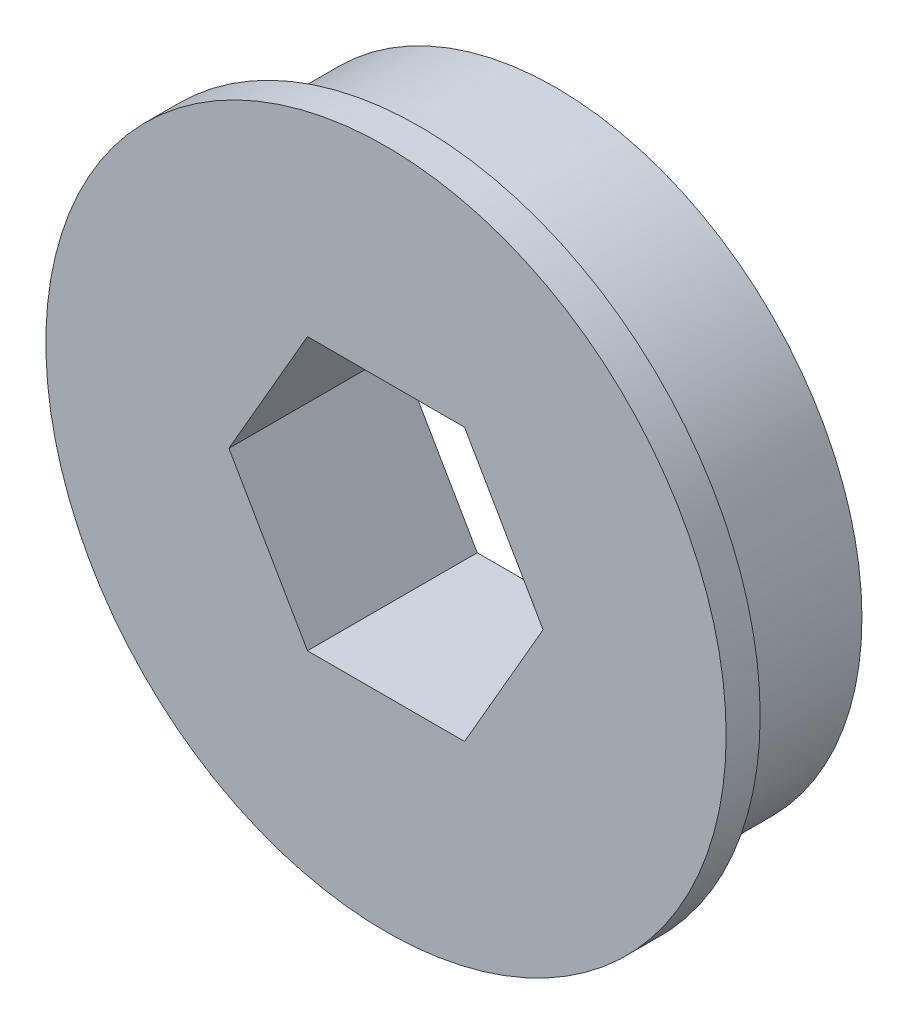
ISO-10303-21;
HEADER;
FILE_DESCRIPTION(('STEP AP214'),'2;1');
FILE_NAME('part.step','',(''),(''),'','','');
FILE_SCHEMA(('AUTOMOTIVE_DESIGN { 1 0 10303 214 1 1 1 1 }'));
ENDSEC;
DATA;
#1=APPLICATION_CONTEXT('core data for automotive mechanical design processes');
#2=APPLICATION_PROTOCOL_DEFINITION('international standard','automotive_design',2000,#1);
#3=PRODUCT_CONTEXT('',#1,'mechanical');
#4=PRODUCT('Part','Part','',(#3));
#5=PRODUCT_RELATED_PRODUCT_CATEGORY('part','',(#4));
#6=PRODUCT_DEFINITION_FORMATION('','',#4);
#7=PRODUCT_DEFINITION_CONTEXT('part definition',#1,'design');
#8=PRODUCT_DEFINITION('design','',#6,#7);
#9=PRODUCT_DEFINITION_SHAPE('','',#8);
#10=(LENGTH_UNIT() NAMED_UNIT(*) SI_UNIT(.MILLI.,.METRE.));
#11=(NAMED_UNIT(*) PLANE_ANGLE_UNIT() SI_UNIT($,.RADIAN.));
#12=(NAMED_UNIT(*) SI_UNIT($,.STERADIAN.) SOLID_ANGLE_UNIT());
#13=UNCERTAINTY_MEASURE_WITH_UNIT(LENGTH_MEASURE(1.E-05),#10,'distance_accuracy_value','');
#14=(GEOMETRIC_REPRESENTATION_CONTEXT(3) GLOBAL_UNCERTAINTY_ASSIGNED_CONTEXT((#13)) GLOBAL_UNIT_ASSIGNED_CONTEXT((#10,
#11,#12)) REPRESENTATION_CONTEXT('',''));
#15=CARTESIAN_POINT('',(0.,0.,0.));
#16=DIRECTION('',(0.,0.,1.));
#17=DIRECTION('',(1.,0.,0.));
#18=AXIS2_PLACEMENT_3D('',#15,#16,#17);
#19=CARTESIAN_POINT('',(0.,0.,0.));
#20=DIRECTION('',(0.,0.,1.));
#21=DIRECTION('',(1.,0.,0.));
#22=AXIS2_PLACEMENT_3D('',#19,#20,#21);
#23=CYLINDRICAL_SURFACE('',#22,15.875);
#24=CARTESIAN_POINT('',(0.,0.,0.));
#25=DIRECTION('',(0.,0.,1.));
#26=DIRECTION('',(1.,0.,0.));
#27=AXIS2_PLACEMENT_3D('',#24,#25,#26);
#28=CIRCLE('',#27,15.875);
#29=CARTESIAN_POINT('',(15.875,0.,0.));
#30=VERTEX_POINT('',#29);
#31=EDGE_CURVE('E11',#30,#30,#28,.T.);
#32=ORIENTED_EDGE('',*,*,#31,.F.);
#33=EDGE_LOOP('',(#32));
#34=FACE_BOUND('',#33,.T.);
#35=CARTESIAN_POINT('',(0.,0.,-1.5875));
#36=DIRECTION('',(0.,0.,1.));
#37=DIRECTION('',(1.,0.,0.));
#38=AXIS2_PLACEMENT_3D('',#35,#36,#37);
#39=CIRCLE('',#38,15.875);
#40=CARTESIAN_POINT('',(15.875,0.,-1.5875));
#41=VERTEX_POINT('',#40);
#42=EDGE_CURVE('E131',#41,#41,#39,.T.);
#43=ORIENTED_EDGE('',*,*,#42,.T.);
#44=EDGE_LOOP('',(#43));
#45=FACE_BOUND('',#44,.T.);
#46=ADVANCED_FACE('F34',(#34,#45),#23,.T.);
#47=CARTESIAN_POINT('',(0.,15.875,0.));
#48=DIRECTION('',(0.,0.,-1.));
#49=DIRECTION('',(-1.,0.,0.));
#50=AXIS2_PLACEMENT_3D('',#47,#48,#49);
#51=PLANE('',#50);
#52=DIRECTION('',(-0.5,0.866025403784439,0.));
#53=VECTOR('',#52,1.);
#54=CARTESIAN_POINT('',(7.33234841870824,0.,0.));
#55=LINE('',#54,#53);
#56=CARTESIAN_POINT('',(7.33234841870824,0.,0.));
#57=VERTEX_POINT('',#56);
#58=CARTESIAN_POINT('',(3.66617420935412,6.35,0.));
#59=VERTEX_POINT('',#58);
#60=EDGE_CURVE('E119',#57,#59,#55,.T.);
#61=ORIENTED_EDGE('',*,*,#60,.F.);
#62=DIRECTION('',(0.499999999999999,0.866025403784439,0.));
#63=VECTOR('',#62,1.);
#64=CARTESIAN_POINT('',(3.66617420935412,-6.35,0.));
#65=LINE('',#64,#63);
#66=CARTESIAN_POINT('',(3.66617420935412,-6.35,0.));
#67=VERTEX_POINT('',#66);
#68=EDGE_CURVE('E48',#67,#57,#65,.T.);
#69=ORIENTED_EDGE('',*,*,#68,.F.);
#70=DIRECTION('',(1.,0.,0.));
#71=VECTOR('',#70,1.);
#72=CARTESIAN_POINT('',(-3.66617420935411,-6.35,0.));
#73=LINE('',#72,#71);
#74=CARTESIAN_POINT('',(-3.66617420935411,-6.35,0.));
#75=VERTEX_POINT('',#74);
#76=EDGE_CURVE('E105',#75,#67,#73,.T.);
#77=ORIENTED_EDGE('',*,*,#76,.F.);
#78=DIRECTION('',(0.5,-0.866025403784438,0.));
#79=VECTOR('',#78,1.);
#80=CARTESIAN_POINT('',(-7.33234841870824,0.,0.));
#81=LINE('',#80,#79);
#82=CARTESIAN_POINT('',(-7.33234841870824,0.,0.));
#83=VERTEX_POINT('',#82);
#84=EDGE_CURVE('E108',#83,#75,#81,.T.);
#85=ORIENTED_EDGE('',*,*,#84,.F.);
#86=DIRECTION('',(-0.499999999999999,-0.866025403784439,0.));
#87=VECTOR('',#86,1.);
#88=CARTESIAN_POINT('',(-3.66617420935412,6.35,0.));
#89=LINE('',#88,#87);
#90=CARTESIAN_POINT('',(-3.66617420935412,6.35,0.));
#91=VERTEX_POINT('',#90);
#92=EDGE_CURVE('E124',#91,#83,#89,.T.);
#93=ORIENTED_EDGE('',*,*,#92,.F.);
#94=DIRECTION('',(-1.,0.,0.));
#95=VECTOR('',#94,1.);
#96=CARTESIAN_POINT('',(3.66617420935412,6.35,0.));
#97=LINE('',#96,#95);
#98=EDGE_CURVE('E121',#59,#91,#97,.T.);
#99=ORIENTED_EDGE('',*,*,#98,.F.);
#100=EDGE_LOOP('',(#61,#69,#77,#85,#93,#99));
#101=FACE_BOUND('',#100,.T.);
#102=ORIENTED_EDGE('',*,*,#31,.T.);
#103=EDGE_LOOP('',(#102));
#104=FACE_BOUND('',#103,.T.);
#105=ADVANCED_FACE('F148',(#101,#104),#51,.F.);
#106=CARTESIAN_POINT('',(0.,0.,-7.9248));
#107=DIRECTION('',(0.,0.,1.));
#108=DIRECTION('',(1.,0.,0.));
#109=AXIS2_PLACEMENT_3D('',#106,#107,#108);
#110=PLANE('',#109);
#111=DIRECTION('',(1.,0.,0.));
#112=VECTOR('',#111,1.);
#113=CARTESIAN_POINT('',(-3.66617420935411,-6.35,-7.9248));
#114=LINE('',#113,#112);
#115=CARTESIAN_POINT('',(-3.66617420935411,-6.35,-7.9248));
#116=VERTEX_POINT('',#115);
#117=CARTESIAN_POINT('',(3.66617420935412,-6.35,-7.9248));
#118=VERTEX_POINT('',#117);
#119=EDGE_CURVE('E94',#116,#118,#114,.T.);
#120=ORIENTED_EDGE('',*,*,#119,.T.);
#121=DIRECTION('',(0.499999999999999,0.866025403784439,0.));
#122=VECTOR('',#121,1.);
#123=CARTESIAN_POINT('',(3.66617420935412,-6.35,-7.9248));
#124=LINE('',#123,#122);
#125=CARTESIAN_POINT('',(7.33234841870824,0.,-7.9248));
#126=VERTEX_POINT('',#125);
#127=EDGE_CURVE('E88',#118,#126,#124,.T.);
#128=ORIENTED_EDGE('',*,*,#127,.T.);
#129=DIRECTION('',(-0.5,0.866025403784439,0.));
#130=VECTOR('',#129,1.);
#131=CARTESIAN_POINT('',(7.33234841870824,0.,-7.9248));
#132=LINE('',#131,#130);
#133=CARTESIAN_POINT('',(3.66617420935412,6.35,-7.9248));
#134=VERTEX_POINT('',#133);
#135=EDGE_CURVE('E97',#126,#134,#132,.T.);
#136=ORIENTED_EDGE('',*,*,#135,.T.);
#137=DIRECTION('',(-1.,0.,0.));
#138=VECTOR('',#137,1.);
#139=CARTESIAN_POINT('',(3.66617420935412,6.35,-7.9248));
#140=LINE('',#139,#138);
#141=CARTESIAN_POINT('',(-3.66617420935412,6.35,-7.9248));
#142=VERTEX_POINT('',#141);
#143=EDGE_CURVE('E56',#134,#142,#140,.T.);
#144=ORIENTED_EDGE('',*,*,#143,.T.);
#145=DIRECTION('',(-0.499999999999999,-0.866025403784439,0.));
#146=VECTOR('',#145,1.);
#147=CARTESIAN_POINT('',(-3.66617420935412,6.35,-7.9248));
#148=LINE('',#147,#146);
#149=CARTESIAN_POINT('',(-7.33234841870824,0.,-7.9248));
#150=VERTEX_POINT('',#149);
#151=EDGE_CURVE('E112',#142,#150,#148,.T.);
#152=ORIENTED_EDGE('',*,*,#151,.T.);
#153=DIRECTION('',(0.5,-0.866025403784438,0.));
#154=VECTOR('',#153,1.);
#155=CARTESIAN_POINT('',(-7.33234841870824,0.,-7.9248));
#156=LINE('',#155,#154);
#157=EDGE_CURVE('E115',#150,#116,#156,.T.);
#158=ORIENTED_EDGE('',*,*,#157,.T.);
#159=EDGE_LOOP('',(#120,#128,#136,#144,#152,#158));
#160=FACE_BOUND('',#159,.T.);
#161=CARTESIAN_POINT('',(0.,0.,-7.9248));
#162=DIRECTION('',(0.,0.,1.));
#163=DIRECTION('',(1.,0.,0.));
#164=AXIS2_PLACEMENT_3D('',#161,#162,#163);
#165=CIRCLE('',#164,14.2875);
#166=CARTESIAN_POINT('',(14.2875,0.,-7.9248));
#167=VERTEX_POINT('',#166);
#168=EDGE_CURVE('E41',#167,#167,#165,.T.);
#169=ORIENTED_EDGE('',*,*,#168,.F.);
#170=EDGE_LOOP('',(#169));
#171=FACE_BOUND('',#170,.T.);
#172=ADVANCED_FACE('F101',(#160,#171),#110,.F.);
#173=CARTESIAN_POINT('',(0.,0.,0.));
#174=DIRECTION('',(0.,0.,1.));
#175=DIRECTION('',(1.,0.,0.));
#176=AXIS2_PLACEMENT_3D('',#173,#174,#175);
#177=CYLINDRICAL_SURFACE('',#176,14.2875);
#178=CARTESIAN_POINT('',(0.,0.,-1.5875));
#179=DIRECTION('',(0.,0.,1.));
#180=DIRECTION('',(1.,0.,0.));
#181=AXIS2_PLACEMENT_3D('',#178,#179,#180);
#182=CIRCLE('',#181,14.2875);
#183=CARTESIAN_POINT('',(14.2875,0.,-1.5875));
#184=VERTEX_POINT('',#183);
#185=EDGE_CURVE('E141',#184,#184,#182,.T.);
#186=ORIENTED_EDGE('',*,*,#185,.F.);
#187=EDGE_LOOP('',(#186));
#188=FACE_BOUND('',#187,.T.);
#189=ORIENTED_EDGE('',*,*,#168,.T.);
#190=EDGE_LOOP('',(#189));
#191=FACE_BOUND('',#190,.T.);
#192=ADVANCED_FACE('F146',(#188,#191),#177,.T.);
#193=CARTESIAN_POINT('',(0.,14.2875,-1.5875));
#194=DIRECTION('',(0.,0.,1.));
#195=DIRECTION('',(1.,0.,0.));
#196=AXIS2_PLACEMENT_3D('',#193,#194,#195);
#197=PLANE('',#196);
#198=ORIENTED_EDGE('',*,*,#42,.F.);
#199=EDGE_LOOP('',(#198));
#200=FACE_BOUND('',#199,.T.);
#201=ORIENTED_EDGE('',*,*,#185,.T.);
#202=EDGE_LOOP('',(#201));
#203=FACE_BOUND('',#202,.T.);
#204=ADVANCED_FACE('F154',(#200,#203),#197,.F.);
#205=CARTESIAN_POINT('',(3.66617420935412,-6.35,-7.9248));
#206=DIRECTION('',(0.866025403784439,-0.499999999999999,0.));
#207=DIRECTION('',(0.499999999999999,0.866025403784439,0.));
#208=AXIS2_PLACEMENT_3D('',#205,#206,#207);
#209=PLANE('',#208);
#210=ORIENTED_EDGE('',*,*,#68,.T.);
#211=DIRECTION('',(0.,0.,1.));
#212=VECTOR('',#211,1.);
#213=CARTESIAN_POINT('',(7.33234841870824,0.,-7.9248));
#214=LINE('',#213,#212);
#215=EDGE_CURVE('E84',#126,#57,#214,.T.);
#216=ORIENTED_EDGE('',*,*,#215,.F.);
#217=ORIENTED_EDGE('',*,*,#127,.F.);
#218=DIRECTION('',(0.,0.,1.));
#219=VECTOR('',#218,1.);
#220=CARTESIAN_POINT('',(3.66617420935412,-6.35,-7.9248));
#221=LINE('',#220,#219);
#222=EDGE_CURVE('E129',#118,#67,#221,.T.);
#223=ORIENTED_EDGE('',*,*,#222,.T.);
#224=EDGE_LOOP('',(#210,#216,#217,#223));
#225=FACE_BOUND('',#224,.T.);
#226=ADVANCED_FACE('F86',(#225),#209,.F.);
#227=CARTESIAN_POINT('',(-3.66617420935411,-6.35,-7.9248));
#228=DIRECTION('',(0.,-1.,0.));
#229=DIRECTION('',(1.,0.,0.));
#230=AXIS2_PLACEMENT_3D('',#227,#228,#229);
#231=PLANE('',#230);
#232=ORIENTED_EDGE('',*,*,#76,.T.);
#233=ORIENTED_EDGE('',*,*,#222,.F.);
#234=ORIENTED_EDGE('',*,*,#119,.F.);
#235=DIRECTION('',(0.,0.,1.));
#236=VECTOR('',#235,1.);
#237=CARTESIAN_POINT('',(-3.66617420935411,-6.35,-7.9248));
#238=LINE('',#237,#236);
#239=EDGE_CURVE('E132',#116,#75,#238,.T.);
#240=ORIENTED_EDGE('',*,*,#239,.T.);
#241=EDGE_LOOP('',(#232,#233,#234,#240));
#242=FACE_BOUND('',#241,.T.);
#243=ADVANCED_FACE('F173',(#242),#231,.F.);
#244=CARTESIAN_POINT('',(-7.33234841870824,0.,-7.9248));
#245=DIRECTION('',(-0.866025403784439,-0.5,0.));
#246=DIRECTION('',(0.5,-0.866025403784439,0.));
#247=AXIS2_PLACEMENT_3D('',#244,#245,#246);
#248=PLANE('',#247);
#249=ORIENTED_EDGE('',*,*,#84,.T.);
#250=ORIENTED_EDGE('',*,*,#239,.F.);
#251=ORIENTED_EDGE('',*,*,#157,.F.);
#252=DIRECTION('',(0.,0.,1.));
#253=VECTOR('',#252,1.);
#254=CARTESIAN_POINT('',(-7.33234841870824,0.,-7.9248));
#255=LINE('',#254,#253);
#256=EDGE_CURVE('E134',#150,#83,#255,.T.);
#257=ORIENTED_EDGE('',*,*,#256,.T.);
#258=EDGE_LOOP('',(#249,#250,#251,#257));
#259=FACE_BOUND('',#258,.T.);
#260=ADVANCED_FACE('F184',(#259),#248,.F.);
#261=CARTESIAN_POINT('',(-3.66617420935412,6.35,-7.9248));
#262=DIRECTION('',(-0.866025403784439,0.499999999999999,0.));
#263=DIRECTION('',(-0.499999999999999,-0.866025403784439,0.));
#264=AXIS2_PLACEMENT_3D('',#261,#262,#263);
#265=PLANE('',#264);
#266=ORIENTED_EDGE('',*,*,#92,.T.);
#267=ORIENTED_EDGE('',*,*,#256,.F.);
#268=ORIENTED_EDGE('',*,*,#151,.F.);
#269=DIRECTION('',(0.,0.,1.));
#270=VECTOR('',#269,1.);
#271=CARTESIAN_POINT('',(-3.66617420935412,6.35,-7.9248));
#272=LINE('',#271,#270);
#273=EDGE_CURVE('E136',#142,#91,#272,.T.);
#274=ORIENTED_EDGE('',*,*,#273,.T.);
#275=EDGE_LOOP('',(#266,#267,#268,#274));
#276=FACE_BOUND('',#275,.T.);
#277=ADVANCED_FACE('F181',(#276),#265,.F.);
#278=CARTESIAN_POINT('',(3.66617420935412,6.35,-7.9248));
#279=DIRECTION('',(0.,1.,0.));
#280=DIRECTION('',(-1.,0.,0.));
#281=AXIS2_PLACEMENT_3D('',#278,#279,#280);
#282=PLANE('',#281);
#283=ORIENTED_EDGE('',*,*,#98,.T.);
#284=ORIENTED_EDGE('',*,*,#273,.F.);
#285=ORIENTED_EDGE('',*,*,#143,.F.);
#286=DIRECTION('',(0.,0.,1.));
#287=VECTOR('',#286,1.);
#288=CARTESIAN_POINT('',(3.66617420935412,6.35,-7.9248));
#289=LINE('',#288,#287);
#290=EDGE_CURVE('E93',#134,#59,#289,.T.);
#291=ORIENTED_EDGE('',*,*,#290,.T.);
#292=EDGE_LOOP('',(#283,#284,#285,#291));
#293=FACE_BOUND('',#292,.T.);
#294=ADVANCED_FACE('F178',(#293),#282,.F.);
#295=CARTESIAN_POINT('',(7.33234841870824,0.,-7.9248));
#296=DIRECTION('',(0.866025403784439,0.5,0.));
#297=DIRECTION('',(-0.5,0.866025403784439,0.));
#298=AXIS2_PLACEMENT_3D('',#295,#296,#297);
#299=PLANE('',#298);
#300=ORIENTED_EDGE('',*,*,#60,.T.);
#301=ORIENTED_EDGE('',*,*,#290,.F.);
#302=ORIENTED_EDGE('',*,*,#135,.F.);
#303=ORIENTED_EDGE('',*,*,#215,.T.);
#304=EDGE_LOOP('',(#300,#301,#302,#303));
#305=FACE_BOUND('',#304,.T.);
#306=ADVANCED_FACE('F98',(#305),#299,.F.);
#307=CLOSED_SHELL('',(#46,#105,#172,#192,#204,#226,#243,#260,#277,#294,#306));
#308=MANIFOLD_SOLID_BREP('B2',#307);
#309=ADVANCED_BREP_SHAPE_REPRESENTATION('',(#18,#308),#14);
#310=SHAPE_DEFINITION_REPRESENTATION(#9,#309);
ENDSEC;
END-ISO-10303-21;
